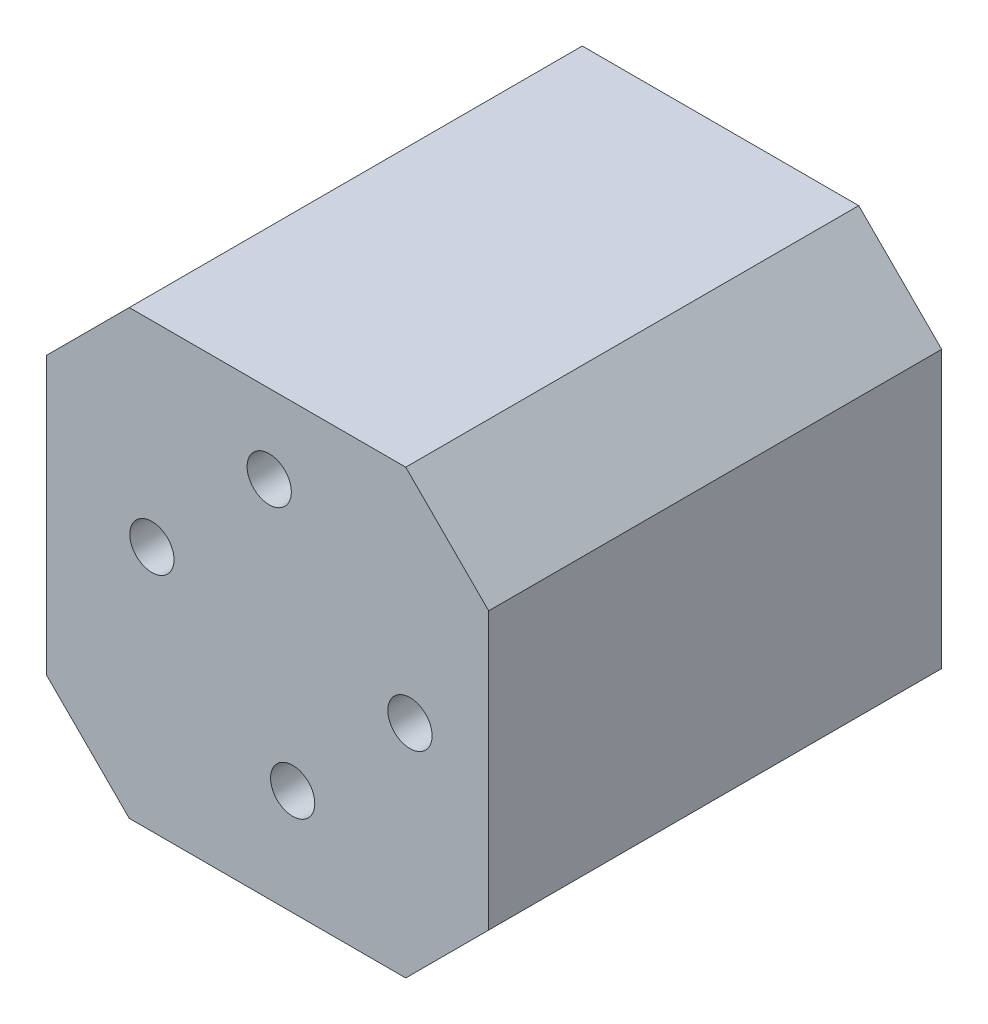
ISO-10303-21;
HEADER;
FILE_DESCRIPTION(('STEP AP214'),'2;1');
FILE_NAME('part.step','',(''),(''),'','','');
FILE_SCHEMA(('AUTOMOTIVE_DESIGN { 1 0 10303 214 1 1 1 1 }'));
ENDSEC;
DATA;
#1=APPLICATION_CONTEXT('core data for automotive mechanical design processes');
#2=APPLICATION_PROTOCOL_DEFINITION('international standard','automotive_design',2000,#1);
#3=PRODUCT_CONTEXT('',#1,'mechanical');
#4=PRODUCT('Part','Part','',(#3));
#5=PRODUCT_RELATED_PRODUCT_CATEGORY('part','',(#4));
#6=PRODUCT_DEFINITION_FORMATION('','',#4);
#7=PRODUCT_DEFINITION_CONTEXT('part definition',#1,'design');
#8=PRODUCT_DEFINITION('design','',#6,#7);
#9=PRODUCT_DEFINITION_SHAPE('','',#8);
#10=(LENGTH_UNIT() NAMED_UNIT(*) SI_UNIT(.MILLI.,.METRE.));
#11=(NAMED_UNIT(*) PLANE_ANGLE_UNIT() SI_UNIT($,.RADIAN.));
#12=(NAMED_UNIT(*) SI_UNIT($,.STERADIAN.) SOLID_ANGLE_UNIT());
#13=UNCERTAINTY_MEASURE_WITH_UNIT(LENGTH_MEASURE(1.E-05),#10,'distance_accuracy_value','');
#14=(GEOMETRIC_REPRESENTATION_CONTEXT(3) GLOBAL_UNCERTAINTY_ASSIGNED_CONTEXT((#13)) GLOBAL_UNIT_ASSIGNED_CONTEXT((#10,
#11,#12)) REPRESENTATION_CONTEXT('',''));
#15=CARTESIAN_POINT('',(0.,0.,0.));
#16=DIRECTION('',(0.,0.,1.));
#17=DIRECTION('',(1.,0.,0.));
#18=AXIS2_PLACEMENT_3D('',#15,#16,#17);
#19=CARTESIAN_POINT('',(7.5,40.,40.96));
#20=DIRECTION('',(0.,-1.,0.));
#21=DIRECTION('',(0.,0.,-1.));
#22=AXIS2_PLACEMENT_3D('',#19,#20,#21);
#23=PLANE('',#22);
#24=DIRECTION('',(-1.,0.,0.));
#25=VECTOR('',#24,1.);
#26=CARTESIAN_POINT('',(7.5,40.,0.));
#27=LINE('',#26,#25);
#28=CARTESIAN_POINT('',(32.5,40.,0.));
#29=VERTEX_POINT('',#28);
#30=CARTESIAN_POINT('',(7.5,40.,0.));
#31=VERTEX_POINT('',#30);
#32=EDGE_CURVE('E139',#29,#31,#27,.T.);
#33=ORIENTED_EDGE('',*,*,#32,.T.);
#34=DIRECTION('',(0.,0.,-1.));
#35=VECTOR('',#34,1.);
#36=CARTESIAN_POINT('',(7.5,40.,40.96));
#37=LINE('',#36,#35);
#38=CARTESIAN_POINT('',(7.5,40.,40.96));
#39=VERTEX_POINT('',#38);
#40=EDGE_CURVE('E11',#39,#31,#37,.T.);
#41=ORIENTED_EDGE('',*,*,#40,.F.);
#42=DIRECTION('',(-1.,0.,0.));
#43=VECTOR('',#42,1.);
#44=CARTESIAN_POINT('',(7.5,40.,40.96));
#45=LINE('',#44,#43);
#46=CARTESIAN_POINT('',(32.5,40.,40.96));
#47=VERTEX_POINT('',#46);
#48=EDGE_CURVE('E162',#47,#39,#45,.T.);
#49=ORIENTED_EDGE('',*,*,#48,.F.);
#50=DIRECTION('',(0.,0.,-1.));
#51=VECTOR('',#50,1.);
#52=CARTESIAN_POINT('',(32.5,40.,40.96));
#53=LINE('',#52,#51);
#54=EDGE_CURVE('E135',#47,#29,#53,.T.);
#55=ORIENTED_EDGE('',*,*,#54,.T.);
#56=EDGE_LOOP('',(#33,#41,#49,#55));
#57=FACE_BOUND('',#56,.T.);
#58=ADVANCED_FACE('F38',(#57),#23,.F.);
#59=CARTESIAN_POINT('',(7.5,40.,40.96));
#60=DIRECTION('',(0.707106781186548,-0.707106781186547,0.));
#61=DIRECTION('',(0.707106781186547,0.707106781186548,0.));
#62=AXIS2_PLACEMENT_3D('',#59,#60,#61);
#63=PLANE('',#62);
#64=DIRECTION('',(-0.707106781186547,-0.707106781186548,0.));
#65=VECTOR('',#64,1.);
#66=CARTESIAN_POINT('',(7.5,40.,0.));
#67=LINE('',#66,#65);
#68=CARTESIAN_POINT('',(0.,32.5,0.));
#69=VERTEX_POINT('',#68);
#70=EDGE_CURVE('E143',#31,#69,#67,.T.);
#71=ORIENTED_EDGE('',*,*,#70,.T.);
#72=DIRECTION('',(0.,0.,-1.));
#73=VECTOR('',#72,1.);
#74=CARTESIAN_POINT('',(0.,32.5,40.96));
#75=LINE('',#74,#73);
#76=CARTESIAN_POINT('',(0.,32.5,40.96));
#77=VERTEX_POINT('',#76);
#78=EDGE_CURVE('E47',#77,#69,#75,.T.);
#79=ORIENTED_EDGE('',*,*,#78,.F.);
#80=DIRECTION('',(-0.707106781186547,-0.707106781186548,0.));
#81=VECTOR('',#80,1.);
#82=CARTESIAN_POINT('',(7.5,40.,40.96));
#83=LINE('',#82,#81);
#84=EDGE_CURVE('E98',#39,#77,#83,.T.);
#85=ORIENTED_EDGE('',*,*,#84,.F.);
#86=ORIENTED_EDGE('',*,*,#40,.T.);
#87=EDGE_LOOP('',(#71,#79,#85,#86));
#88=FACE_BOUND('',#87,.T.);
#89=ADVANCED_FACE('F272',(#88),#63,.F.);
#90=CARTESIAN_POINT('',(0.,7.5,40.96));
#91=DIRECTION('',(1.,0.,0.));
#92=DIRECTION('',(0.,0.,-1.));
#93=AXIS2_PLACEMENT_3D('',#90,#91,#92);
#94=PLANE('',#93);
#95=DIRECTION('',(0.,-1.,0.));
#96=VECTOR('',#95,1.);
#97=CARTESIAN_POINT('',(0.,7.5,0.));
#98=LINE('',#97,#96);
#99=CARTESIAN_POINT('',(0.,7.5,0.));
#100=VERTEX_POINT('',#99);
#101=EDGE_CURVE('E147',#69,#100,#98,.T.);
#102=ORIENTED_EDGE('',*,*,#101,.T.);
#103=DIRECTION('',(0.,0.,-1.));
#104=VECTOR('',#103,1.);
#105=CARTESIAN_POINT('',(0.,7.5,40.96));
#106=LINE('',#105,#104);
#107=CARTESIAN_POINT('',(0.,7.5,40.96));
#108=VERTEX_POINT('',#107);
#109=EDGE_CURVE('E173',#108,#100,#106,.T.);
#110=ORIENTED_EDGE('',*,*,#109,.F.);
#111=DIRECTION('',(0.,-1.,0.));
#112=VECTOR('',#111,1.);
#113=CARTESIAN_POINT('',(0.,7.5,40.96));
#114=LINE('',#113,#112);
#115=EDGE_CURVE('E183',#77,#108,#114,.T.);
#116=ORIENTED_EDGE('',*,*,#115,.F.);
#117=ORIENTED_EDGE('',*,*,#78,.T.);
#118=EDGE_LOOP('',(#102,#110,#116,#117));
#119=FACE_BOUND('',#118,.T.);
#120=ADVANCED_FACE('F181',(#119),#94,.F.);
#121=CARTESIAN_POINT('',(0.,7.5,40.96));
#122=DIRECTION('',(0.707106781186547,0.707106781186548,0.));
#123=DIRECTION('',(-0.707106781186548,0.707106781186547,0.));
#124=AXIS2_PLACEMENT_3D('',#121,#122,#123);
#125=PLANE('',#124);
#126=DIRECTION('',(0.707106781186548,-0.707106781186547,0.));
#127=VECTOR('',#126,1.);
#128=CARTESIAN_POINT('',(0.,7.5,0.));
#129=LINE('',#128,#127);
#130=CARTESIAN_POINT('',(7.5,0.,0.));
#131=VERTEX_POINT('',#130);
#132=EDGE_CURVE('E150',#100,#131,#129,.T.);
#133=ORIENTED_EDGE('',*,*,#132,.T.);
#134=DIRECTION('',(0.,0.,-1.));
#135=VECTOR('',#134,1.);
#136=CARTESIAN_POINT('',(7.5,0.,40.96));
#137=LINE('',#136,#135);
#138=CARTESIAN_POINT('',(7.5,0.,40.96));
#139=VERTEX_POINT('',#138);
#140=EDGE_CURVE('E169',#139,#131,#137,.T.);
#141=ORIENTED_EDGE('',*,*,#140,.F.);
#142=DIRECTION('',(0.707106781186548,-0.707106781186547,0.));
#143=VECTOR('',#142,1.);
#144=CARTESIAN_POINT('',(0.,7.5,40.96));
#145=LINE('',#144,#143);
#146=EDGE_CURVE('E196',#108,#139,#145,.T.);
#147=ORIENTED_EDGE('',*,*,#146,.F.);
#148=ORIENTED_EDGE('',*,*,#109,.T.);
#149=EDGE_LOOP('',(#133,#141,#147,#148));
#150=FACE_BOUND('',#149,.T.);
#151=ADVANCED_FACE('F191',(#150),#125,.F.);
#152=CARTESIAN_POINT('',(7.5,0.,40.96));
#153=DIRECTION('',(0.,1.,0.));
#154=DIRECTION('',(0.,0.,1.));
#155=AXIS2_PLACEMENT_3D('',#152,#153,#154);
#156=PLANE('',#155);
#157=DIRECTION('',(1.,0.,0.));
#158=VECTOR('',#157,1.);
#159=CARTESIAN_POINT('',(7.5,0.,0.));
#160=LINE('',#159,#158);
#161=CARTESIAN_POINT('',(32.5,0.,0.));
#162=VERTEX_POINT('',#161);
#163=EDGE_CURVE('E153',#131,#162,#160,.T.);
#164=ORIENTED_EDGE('',*,*,#163,.T.);
#165=DIRECTION('',(0.,0.,-1.));
#166=VECTOR('',#165,1.);
#167=CARTESIAN_POINT('',(32.5,0.,40.96));
#168=LINE('',#167,#166);
#169=CARTESIAN_POINT('',(32.5,0.,40.96));
#170=VERTEX_POINT('',#169);
#171=EDGE_CURVE('E128',#170,#162,#168,.T.);
#172=ORIENTED_EDGE('',*,*,#171,.F.);
#173=DIRECTION('',(1.,0.,0.));
#174=VECTOR('',#173,1.);
#175=CARTESIAN_POINT('',(7.5,0.,40.96));
#176=LINE('',#175,#174);
#177=EDGE_CURVE('E117',#139,#170,#176,.T.);
#178=ORIENTED_EDGE('',*,*,#177,.F.);
#179=ORIENTED_EDGE('',*,*,#140,.T.);
#180=EDGE_LOOP('',(#164,#172,#178,#179));
#181=FACE_BOUND('',#180,.T.);
#182=ADVANCED_FACE('F194',(#181),#156,.F.);
#183=CARTESIAN_POINT('',(40.,7.5,40.96));
#184=DIRECTION('',(-0.707106781186548,0.707106781186547,0.));
#185=DIRECTION('',(-0.707106781186547,-0.707106781186548,0.));
#186=AXIS2_PLACEMENT_3D('',#183,#184,#185);
#187=PLANE('',#186);
#188=DIRECTION('',(0.707106781186547,0.707106781186548,0.));
#189=VECTOR('',#188,1.);
#190=CARTESIAN_POINT('',(40.,7.5,0.));
#191=LINE('',#190,#189);
#192=CARTESIAN_POINT('',(40.,7.5,0.));
#193=VERTEX_POINT('',#192);
#194=EDGE_CURVE('E126',#162,#193,#191,.T.);
#195=ORIENTED_EDGE('',*,*,#194,.T.);
#196=DIRECTION('',(0.,0.,-1.));
#197=VECTOR('',#196,1.);
#198=CARTESIAN_POINT('',(40.,7.5,40.96));
#199=LINE('',#198,#197);
#200=CARTESIAN_POINT('',(40.,7.5,40.96));
#201=VERTEX_POINT('',#200);
#202=EDGE_CURVE('E123',#201,#193,#199,.T.);
#203=ORIENTED_EDGE('',*,*,#202,.F.);
#204=DIRECTION('',(0.707106781186547,0.707106781186548,0.));
#205=VECTOR('',#204,1.);
#206=CARTESIAN_POINT('',(40.,7.5,40.96));
#207=LINE('',#206,#205);
#208=EDGE_CURVE('E111',#170,#201,#207,.T.);
#209=ORIENTED_EDGE('',*,*,#208,.F.);
#210=ORIENTED_EDGE('',*,*,#171,.T.);
#211=EDGE_LOOP('',(#195,#203,#209,#210));
#212=FACE_BOUND('',#211,.T.);
#213=ADVANCED_FACE('F124',(#212),#187,.F.);
#214=CARTESIAN_POINT('',(40.,7.5,40.96));
#215=DIRECTION('',(-1.,0.,0.));
#216=DIRECTION('',(0.,0.,1.));
#217=AXIS2_PLACEMENT_3D('',#214,#215,#216);
#218=PLANE('',#217);
#219=DIRECTION('',(0.,1.,0.));
#220=VECTOR('',#219,1.);
#221=CARTESIAN_POINT('',(40.,7.5,0.));
#222=LINE('',#221,#220);
#223=CARTESIAN_POINT('',(40.,32.5,0.));
#224=VERTEX_POINT('',#223);
#225=EDGE_CURVE('E84',#193,#224,#222,.T.);
#226=ORIENTED_EDGE('',*,*,#225,.T.);
#227=DIRECTION('',(0.,0.,-1.));
#228=VECTOR('',#227,1.);
#229=CARTESIAN_POINT('',(40.,32.5,40.96));
#230=LINE('',#229,#228);
#231=CARTESIAN_POINT('',(40.,32.5,40.96));
#232=VERTEX_POINT('',#231);
#233=EDGE_CURVE('E129',#232,#224,#230,.T.);
#234=ORIENTED_EDGE('',*,*,#233,.F.);
#235=DIRECTION('',(0.,1.,0.));
#236=VECTOR('',#235,1.);
#237=CARTESIAN_POINT('',(40.,7.5,40.96));
#238=LINE('',#237,#236);
#239=EDGE_CURVE('E115',#201,#232,#238,.T.);
#240=ORIENTED_EDGE('',*,*,#239,.F.);
#241=ORIENTED_EDGE('',*,*,#202,.T.);
#242=EDGE_LOOP('',(#226,#234,#240,#241));
#243=FACE_BOUND('',#242,.T.);
#244=ADVANCED_FACE('F131',(#243),#218,.F.);
#245=CARTESIAN_POINT('',(32.5,40.,40.96));
#246=DIRECTION('',(-0.707106781186548,-0.707106781186548,0.));
#247=DIRECTION('',(0.707106781186548,-0.707106781186548,0.));
#248=AXIS2_PLACEMENT_3D('',#245,#246,#247);
#249=PLANE('',#248);
#250=DIRECTION('',(-0.707106781186548,0.707106781186548,0.));
#251=VECTOR('',#250,1.);
#252=CARTESIAN_POINT('',(32.5,40.,0.));
#253=LINE('',#252,#251);
#254=EDGE_CURVE('E90',#224,#29,#253,.T.);
#255=ORIENTED_EDGE('',*,*,#254,.T.);
#256=ORIENTED_EDGE('',*,*,#54,.F.);
#257=DIRECTION('',(-0.707106781186548,0.707106781186548,0.));
#258=VECTOR('',#257,1.);
#259=CARTESIAN_POINT('',(32.5,40.,40.96));
#260=LINE('',#259,#258);
#261=EDGE_CURVE('E55',#232,#47,#260,.T.);
#262=ORIENTED_EDGE('',*,*,#261,.F.);
#263=ORIENTED_EDGE('',*,*,#233,.T.);
#264=EDGE_LOOP('',(#255,#256,#262,#263));
#265=FACE_BOUND('',#264,.T.);
#266=ADVANCED_FACE('F249',(#265),#249,.F.);
#267=CARTESIAN_POINT('',(0.,0.,40.96));
#268=DIRECTION('',(0.,0.,1.));
#269=DIRECTION('',(1.,0.,0.));
#270=AXIS2_PLACEMENT_3D('',#267,#268,#269);
#271=PLANE('',#270);
#272=CARTESIAN_POINT('',(20.1543708055382,32.88225099,40.96));
#273=DIRECTION('',(0.,0.,1.));
#274=DIRECTION('',(1.,0.,0.));
#275=AXIS2_PLACEMENT_3D('',#272,#273,#274);
#276=CIRCLE('',#275,2.);
#277=CARTESIAN_POINT('',(22.1543708055382,32.88225099,40.96));
#278=VERTEX_POINT('',#277);
#279=EDGE_CURVE('E230',#278,#278,#276,.T.);
#280=ORIENTED_EDGE('',*,*,#279,.F.);
#281=EDGE_LOOP('',(#280));
#282=FACE_BOUND('',#281,.T.);
#283=CARTESIAN_POINT('',(9.54776908774003,22.2756492722018,40.96));
#284=DIRECTION('',(0.,0.,1.));
#285=DIRECTION('',(1.,0.,0.));
#286=AXIS2_PLACEMENT_3D('',#283,#284,#285);
#287=CIRCLE('',#286,2.);
#288=CARTESIAN_POINT('',(11.54776908774,22.2756492722018,40.96));
#289=VERTEX_POINT('',#288);
#290=EDGE_CURVE('E222',#289,#289,#287,.T.);
#291=ORIENTED_EDGE('',*,*,#290,.F.);
#292=EDGE_LOOP('',(#291));
#293=FACE_BOUND('',#292,.T.);
#294=CARTESIAN_POINT('',(22.2756911490979,9.54772721084395,40.96));
#295=DIRECTION('',(0.,0.,1.));
#296=DIRECTION('',(1.,0.,0.));
#297=AXIS2_PLACEMENT_3D('',#294,#295,#296);
#298=CIRCLE('',#297,2.00000000000001);
#299=CARTESIAN_POINT('',(24.2756911490979,9.54772721084395,40.96));
#300=VERTEX_POINT('',#299);
#301=EDGE_CURVE('E214',#300,#300,#298,.T.);
#302=ORIENTED_EDGE('',*,*,#301,.F.);
#303=EDGE_LOOP('',(#302));
#304=FACE_BOUND('',#303,.T.);
#305=CARTESIAN_POINT('',(32.8822928668961,20.1543289286422,40.96));
#306=DIRECTION('',(0.,0.,1.));
#307=DIRECTION('',(1.,0.,0.));
#308=AXIS2_PLACEMENT_3D('',#305,#306,#307);
#309=CIRCLE('',#308,2.);
#310=CARTESIAN_POINT('',(34.8822928668961,20.1543289286422,40.96));
#311=VERTEX_POINT('',#310);
#312=EDGE_CURVE('E206',#311,#311,#309,.T.);
#313=ORIENTED_EDGE('',*,*,#312,.F.);
#314=EDGE_LOOP('',(#313));
#315=FACE_BOUND('',#314,.T.);
#316=ORIENTED_EDGE('',*,*,#48,.T.);
#317=ORIENTED_EDGE('',*,*,#84,.T.);
#318=ORIENTED_EDGE('',*,*,#115,.T.);
#319=ORIENTED_EDGE('',*,*,#146,.T.);
#320=ORIENTED_EDGE('',*,*,#177,.T.);
#321=ORIENTED_EDGE('',*,*,#208,.T.);
#322=ORIENTED_EDGE('',*,*,#239,.T.);
#323=ORIENTED_EDGE('',*,*,#261,.T.);
#324=EDGE_LOOP('',(#316,#317,#318,#319,#320,#321,#322,#323));
#325=FACE_BOUND('',#324,.T.);
#326=ADVANCED_FACE('F113',(#282,#293,#304,#315,#325),#271,.T.);
#327=CARTESIAN_POINT('',(0.,0.,0.));
#328=DIRECTION('',(0.,0.,1.));
#329=DIRECTION('',(1.,0.,0.));
#330=AXIS2_PLACEMENT_3D('',#327,#328,#329);
#331=PLANE('',#330);
#332=CARTESIAN_POINT('',(20.1543708055382,32.88225099,0.));
#333=DIRECTION('',(0.,0.,1.));
#334=DIRECTION('',(1.,0.,0.));
#335=AXIS2_PLACEMENT_3D('',#332,#333,#334);
#336=CIRCLE('',#335,2.);
#337=CARTESIAN_POINT('',(22.1543708055382,32.88225099,0.));
#338=VERTEX_POINT('',#337);
#339=EDGE_CURVE('E144',#338,#338,#336,.T.);
#340=ORIENTED_EDGE('',*,*,#339,.T.);
#341=EDGE_LOOP('',(#340));
#342=FACE_BOUND('',#341,.T.);
#343=CARTESIAN_POINT('',(9.54776908774003,22.2756492722018,0.));
#344=DIRECTION('',(0.,0.,1.));
#345=DIRECTION('',(1.,0.,0.));
#346=AXIS2_PLACEMENT_3D('',#343,#344,#345);
#347=CIRCLE('',#346,2.);
#348=CARTESIAN_POINT('',(11.54776908774,22.2756492722018,0.));
#349=VERTEX_POINT('',#348);
#350=EDGE_CURVE('E226',#349,#349,#347,.T.);
#351=ORIENTED_EDGE('',*,*,#350,.T.);
#352=EDGE_LOOP('',(#351));
#353=FACE_BOUND('',#352,.T.);
#354=CARTESIAN_POINT('',(22.2756911490979,9.54772721084395,0.));
#355=DIRECTION('',(0.,0.,1.));
#356=DIRECTION('',(1.,0.,0.));
#357=AXIS2_PLACEMENT_3D('',#354,#355,#356);
#358=CIRCLE('',#357,2.00000000000001);
#359=CARTESIAN_POINT('',(24.2756911490979,9.54772721084395,0.));
#360=VERTEX_POINT('',#359);
#361=EDGE_CURVE('E218',#360,#360,#358,.T.);
#362=ORIENTED_EDGE('',*,*,#361,.T.);
#363=EDGE_LOOP('',(#362));
#364=FACE_BOUND('',#363,.T.);
#365=CARTESIAN_POINT('',(32.8822928668961,20.1543289286422,0.));
#366=DIRECTION('',(0.,0.,1.));
#367=DIRECTION('',(1.,0.,0.));
#368=AXIS2_PLACEMENT_3D('',#365,#366,#367);
#369=CIRCLE('',#368,2.);
#370=CARTESIAN_POINT('',(34.8822928668961,20.1543289286422,0.));
#371=VERTEX_POINT('',#370);
#372=EDGE_CURVE('E210',#371,#371,#369,.T.);
#373=ORIENTED_EDGE('',*,*,#372,.T.);
#374=EDGE_LOOP('',(#373));
#375=FACE_BOUND('',#374,.T.);
#376=ORIENTED_EDGE('',*,*,#32,.F.);
#377=ORIENTED_EDGE('',*,*,#254,.F.);
#378=ORIENTED_EDGE('',*,*,#225,.F.);
#379=ORIENTED_EDGE('',*,*,#194,.F.);
#380=ORIENTED_EDGE('',*,*,#163,.F.);
#381=ORIENTED_EDGE('',*,*,#132,.F.);
#382=ORIENTED_EDGE('',*,*,#101,.F.);
#383=ORIENTED_EDGE('',*,*,#70,.F.);
#384=EDGE_LOOP('',(#376,#377,#378,#379,#380,#381,#382,#383));
#385=FACE_BOUND('',#384,.T.);
#386=ADVANCED_FACE('F187',(#342,#353,#364,#375,#385),#331,.F.);
#387=CARTESIAN_POINT('',(32.8822928668961,20.1543289286422,0.));
#388=DIRECTION('',(0.,0.,1.));
#389=DIRECTION('',(1.,0.,0.));
#390=AXIS2_PLACEMENT_3D('',#387,#388,#389);
#391=CYLINDRICAL_SURFACE('',#390,2.);
#392=CARTESIAN_POINT('',(34.8822928668961,20.1543289286422,0.));
#393=CARTESIAN_POINT('',(34.8822928668961,20.1543289286422,0.426666666666666));
#394=CARTESIAN_POINT('',(34.8822928668961,20.1543289286422,0.853333333333333));
#395=CARTESIAN_POINT('',(34.8822928668961,20.1543289286422,1.70666666666667));
#396=CARTESIAN_POINT('',(34.8822928668961,20.1543289286422,2.13333333333333));
#397=CARTESIAN_POINT('',(34.8822928668961,20.1543289286422,2.98666666666667));
#398=CARTESIAN_POINT('',(34.8822928668961,20.1543289286422,3.41333333333333));
#399=CARTESIAN_POINT('',(34.8822928668961,20.1543289286422,4.26666666666667));
#400=CARTESIAN_POINT('',(34.8822928668961,20.1543289286422,4.69333333333333));
#401=CARTESIAN_POINT('',(34.8822928668961,20.1543289286422,5.54666666666667));
#402=CARTESIAN_POINT('',(34.8822928668961,20.1543289286422,5.97333333333333));
#403=CARTESIAN_POINT('',(34.8822928668961,20.1543289286422,6.82666666666667));
#404=CARTESIAN_POINT('',(34.8822928668961,20.1543289286422,7.25333333333333));
#405=CARTESIAN_POINT('',(34.8822928668961,20.1543289286422,8.10666666666667));
#406=CARTESIAN_POINT('',(34.8822928668961,20.1543289286422,8.53333333333333));
#407=CARTESIAN_POINT('',(34.8822928668961,20.1543289286422,9.38666666666667));
#408=CARTESIAN_POINT('',(34.8822928668961,20.1543289286422,9.81333333333333));
#409=CARTESIAN_POINT('',(34.8822928668961,20.1543289286422,10.6666666666667));
#410=CARTESIAN_POINT('',(34.8822928668961,20.1543289286422,11.0933333333333));
#411=CARTESIAN_POINT('',(34.8822928668961,20.1543289286422,11.9466666666667));
#412=CARTESIAN_POINT('',(34.8822928668961,20.1543289286422,12.3733333333333));
#413=CARTESIAN_POINT('',(34.8822928668961,20.1543289286422,13.2266666666667));
#414=CARTESIAN_POINT('',(34.8822928668961,20.1543289286422,13.6533333333333));
#415=CARTESIAN_POINT('',(34.8822928668961,20.1543289286422,14.5066666666667));
#416=CARTESIAN_POINT('',(34.8822928668961,20.1543289286422,14.9333333333333));
#417=CARTESIAN_POINT('',(34.8822928668961,20.1543289286422,15.7866666666667));
#418=CARTESIAN_POINT('',(34.8822928668961,20.1543289286422,16.2133333333333));
#419=CARTESIAN_POINT('',(34.8822928668961,20.1543289286422,17.0666666666667));
#420=CARTESIAN_POINT('',(34.8822928668961,20.1543289286422,17.4933333333333));
#421=CARTESIAN_POINT('',(34.8822928668961,20.1543289286422,18.3466666666667));
#422=CARTESIAN_POINT('',(34.8822928668961,20.1543289286422,18.7733333333333));
#423=CARTESIAN_POINT('',(34.8822928668961,20.1543289286422,19.6266666666667));
#424=CARTESIAN_POINT('',(34.8822928668961,20.1543289286422,20.0533333333333));
#425=CARTESIAN_POINT('',(34.8822928668961,20.1543289286422,20.9066666666667));
#426=CARTESIAN_POINT('',(34.8822928668961,20.1543289286422,21.3333333333333));
#427=CARTESIAN_POINT('',(34.8822928668961,20.1543289286422,22.1866666666667));
#428=CARTESIAN_POINT('',(34.8822928668961,20.1543289286422,22.6133333333333));
#429=CARTESIAN_POINT('',(34.8822928668961,20.1543289286422,23.4666666666667));
#430=CARTESIAN_POINT('',(34.8822928668961,20.1543289286422,23.8933333333333));
#431=CARTESIAN_POINT('',(34.8822928668961,20.1543289286422,24.7466666666667));
#432=CARTESIAN_POINT('',(34.8822928668961,20.1543289286422,25.1733333333333));
#433=CARTESIAN_POINT('',(34.8822928668961,20.1543289286422,26.0266666666667));
#434=CARTESIAN_POINT('',(34.8822928668961,20.1543289286422,26.4533333333333));
#435=CARTESIAN_POINT('',(34.8822928668961,20.1543289286422,27.3066666666667));
#436=CARTESIAN_POINT('',(34.8822928668961,20.1543289286422,27.7333333333333));
#437=CARTESIAN_POINT('',(34.8822928668961,20.1543289286422,28.5866666666667));
#438=CARTESIAN_POINT('',(34.8822928668961,20.1543289286422,29.0133333333333));
#439=CARTESIAN_POINT('',(34.8822928668961,20.1543289286422,29.8666666666667));
#440=CARTESIAN_POINT('',(34.8822928668961,20.1543289286422,30.2933333333333));
#441=CARTESIAN_POINT('',(34.8822928668961,20.1543289286422,31.1466666666667));
#442=CARTESIAN_POINT('',(34.8822928668961,20.1543289286422,31.5733333333333));
#443=CARTESIAN_POINT('',(34.8822928668961,20.1543289286422,32.4266666666667));
#444=CARTESIAN_POINT('',(34.8822928668961,20.1543289286422,32.8533333333333));
#445=CARTESIAN_POINT('',(34.8822928668961,20.1543289286422,33.7066666666667));
#446=CARTESIAN_POINT('',(34.8822928668961,20.1543289286422,34.1333333333333));
#447=CARTESIAN_POINT('',(34.8822928668961,20.1543289286422,34.9866666666667));
#448=CARTESIAN_POINT('',(34.8822928668961,20.1543289286422,35.4133333333333));
#449=CARTESIAN_POINT('',(34.8822928668961,20.1543289286422,36.2666666666667));
#450=CARTESIAN_POINT('',(34.8822928668961,20.1543289286422,36.6933333333333));
#451=CARTESIAN_POINT('',(34.8822928668961,20.1543289286422,37.5466666666667));
#452=CARTESIAN_POINT('',(34.8822928668961,20.1543289286422,37.9733333333333));
#453=CARTESIAN_POINT('',(34.8822928668961,20.1543289286422,38.8266666666667));
#454=CARTESIAN_POINT('',(34.8822928668961,20.1543289286422,39.2533333333333));
#455=CARTESIAN_POINT('',(34.8822928668961,20.1543289286422,40.1066666666667));
#456=CARTESIAN_POINT('',(34.8822928668961,20.1543289286422,40.5333333333333));
#457=CARTESIAN_POINT('',(34.8822928668961,20.1543289286422,40.96));
#458=B_SPLINE_CURVE_WITH_KNOTS('',3,(#392,#393,#394,#395,#396,#397,#398,#399,#400,#401,#402,
#403,#404,#405,#406,#407,#408,#409,#410,#411,#412,#413,#414,#415,#416,#417,#418,#419,#420,#421,
#422,#423,#424,#425,#426,#427,#428,#429,#430,#431,#432,#433,#434,#435,#436,#437,#438,#439,#440,
#441,#442,#443,#444,#445,#446,#447,#448,#449,#450,#451,#452,#453,#454,#455,#456,#457),
.UNSPECIFIED.,.F.,.F.,(4,2,2,2,2,2,2,2,2,2,2,2,2,2,2,2,2,2,2,2,2,2,2,2,2,2,2,2,2,2,2,2,4),(0.,
1.28,2.56,3.84,5.12,6.4,7.68,8.96,10.24,11.52,12.8,14.08,15.36,16.64,17.92,19.2,20.48,21.76,
23.04,24.32,25.6,26.88,28.16,29.44,30.72,32.,33.28,34.56,35.84,37.12,38.4,39.68,40.96),.UNSPECIFIED.);
#459=EDGE_CURVE('BSEAM257',#371,#311,#458,.T.);
#460=ORIENTED_EDGE('',*,*,#372,.F.);
#461=ORIENTED_EDGE('',*,*,#312,.T.);
#462=ORIENTED_EDGE('',*,*,#459,.T.);
#463=ORIENTED_EDGE('',*,*,#459,.F.);
#464=EDGE_LOOP('',(#460,#462,#461,#463));
#465=FACE_BOUND('',#464,.T.);
#466=ADVANCED_FACE('F257',(#465),#391,.F.);
#467=CARTESIAN_POINT('',(22.2756911490979,9.54772721084395,0.));
#468=DIRECTION('',(0.,0.,1.));
#469=DIRECTION('',(1.,0.,0.));
#470=AXIS2_PLACEMENT_3D('',#467,#468,#469);
#471=CYLINDRICAL_SURFACE('',#470,2.00000000000001);
#472=CARTESIAN_POINT('',(24.2756911490979,9.54772721084395,0.));
#473=CARTESIAN_POINT('',(24.2756911490979,9.54772721084395,0.426666666666666));
#474=CARTESIAN_POINT('',(24.2756911490979,9.54772721084395,0.853333333333333));
#475=CARTESIAN_POINT('',(24.2756911490979,9.54772721084395,1.70666666666667));
#476=CARTESIAN_POINT('',(24.2756911490979,9.54772721084395,2.13333333333333));
#477=CARTESIAN_POINT('',(24.2756911490979,9.54772721084395,2.98666666666667));
#478=CARTESIAN_POINT('',(24.2756911490979,9.54772721084395,3.41333333333333));
#479=CARTESIAN_POINT('',(24.2756911490979,9.54772721084395,4.26666666666667));
#480=CARTESIAN_POINT('',(24.2756911490979,9.54772721084395,4.69333333333333));
#481=CARTESIAN_POINT('',(24.2756911490979,9.54772721084395,5.54666666666667));
#482=CARTESIAN_POINT('',(24.2756911490979,9.54772721084395,5.97333333333333));
#483=CARTESIAN_POINT('',(24.2756911490979,9.54772721084395,6.82666666666667));
#484=CARTESIAN_POINT('',(24.2756911490979,9.54772721084395,7.25333333333333));
#485=CARTESIAN_POINT('',(24.2756911490979,9.54772721084395,8.10666666666667));
#486=CARTESIAN_POINT('',(24.2756911490979,9.54772721084395,8.53333333333333));
#487=CARTESIAN_POINT('',(24.2756911490979,9.54772721084395,9.38666666666667));
#488=CARTESIAN_POINT('',(24.2756911490979,9.54772721084395,9.81333333333333));
#489=CARTESIAN_POINT('',(24.2756911490979,9.54772721084395,10.6666666666667));
#490=CARTESIAN_POINT('',(24.2756911490979,9.54772721084395,11.0933333333333));
#491=CARTESIAN_POINT('',(24.2756911490979,9.54772721084395,11.9466666666667));
#492=CARTESIAN_POINT('',(24.2756911490979,9.54772721084395,12.3733333333333));
#493=CARTESIAN_POINT('',(24.2756911490979,9.54772721084395,13.2266666666667));
#494=CARTESIAN_POINT('',(24.2756911490979,9.54772721084395,13.6533333333333));
#495=CARTESIAN_POINT('',(24.2756911490979,9.54772721084395,14.5066666666667));
#496=CARTESIAN_POINT('',(24.2756911490979,9.54772721084395,14.9333333333333));
#497=CARTESIAN_POINT('',(24.2756911490979,9.54772721084395,15.7866666666667));
#498=CARTESIAN_POINT('',(24.2756911490979,9.54772721084395,16.2133333333333));
#499=CARTESIAN_POINT('',(24.2756911490979,9.54772721084395,17.0666666666667));
#500=CARTESIAN_POINT('',(24.2756911490979,9.54772721084395,17.4933333333333));
#501=CARTESIAN_POINT('',(24.2756911490979,9.54772721084395,18.3466666666667));
#502=CARTESIAN_POINT('',(24.2756911490979,9.54772721084395,18.7733333333333));
#503=CARTESIAN_POINT('',(24.2756911490979,9.54772721084395,19.6266666666667));
#504=CARTESIAN_POINT('',(24.2756911490979,9.54772721084395,20.0533333333333));
#505=CARTESIAN_POINT('',(24.2756911490979,9.54772721084395,20.9066666666667));
#506=CARTESIAN_POINT('',(24.2756911490979,9.54772721084395,21.3333333333333));
#507=CARTESIAN_POINT('',(24.2756911490979,9.54772721084395,22.1866666666667));
#508=CARTESIAN_POINT('',(24.2756911490979,9.54772721084395,22.6133333333333));
#509=CARTESIAN_POINT('',(24.2756911490979,9.54772721084395,23.4666666666667));
#510=CARTESIAN_POINT('',(24.2756911490979,9.54772721084395,23.8933333333333));
#511=CARTESIAN_POINT('',(24.2756911490979,9.54772721084395,24.7466666666667));
#512=CARTESIAN_POINT('',(24.2756911490979,9.54772721084395,25.1733333333333));
#513=CARTESIAN_POINT('',(24.2756911490979,9.54772721084395,26.0266666666667));
#514=CARTESIAN_POINT('',(24.2756911490979,9.54772721084395,26.4533333333333));
#515=CARTESIAN_POINT('',(24.2756911490979,9.54772721084395,27.3066666666667));
#516=CARTESIAN_POINT('',(24.2756911490979,9.54772721084395,27.7333333333333));
#517=CARTESIAN_POINT('',(24.2756911490979,9.54772721084395,28.5866666666667));
#518=CARTESIAN_POINT('',(24.2756911490979,9.54772721084395,29.0133333333333));
#519=CARTESIAN_POINT('',(24.2756911490979,9.54772721084395,29.8666666666667));
#520=CARTESIAN_POINT('',(24.2756911490979,9.54772721084395,30.2933333333333));
#521=CARTESIAN_POINT('',(24.2756911490979,9.54772721084395,31.1466666666667));
#522=CARTESIAN_POINT('',(24.2756911490979,9.54772721084395,31.5733333333333));
#523=CARTESIAN_POINT('',(24.2756911490979,9.54772721084395,32.4266666666667));
#524=CARTESIAN_POINT('',(24.2756911490979,9.54772721084395,32.8533333333333));
#525=CARTESIAN_POINT('',(24.2756911490979,9.54772721084395,33.7066666666667));
#526=CARTESIAN_POINT('',(24.2756911490979,9.54772721084395,34.1333333333333));
#527=CARTESIAN_POINT('',(24.2756911490979,9.54772721084395,34.9866666666667));
#528=CARTESIAN_POINT('',(24.2756911490979,9.54772721084395,35.4133333333333));
#529=CARTESIAN_POINT('',(24.2756911490979,9.54772721084395,36.2666666666667));
#530=CARTESIAN_POINT('',(24.2756911490979,9.54772721084395,36.6933333333333));
#531=CARTESIAN_POINT('',(24.2756911490979,9.54772721084395,37.5466666666667));
#532=CARTESIAN_POINT('',(24.2756911490979,9.54772721084395,37.9733333333333));
#533=CARTESIAN_POINT('',(24.2756911490979,9.54772721084395,38.8266666666667));
#534=CARTESIAN_POINT('',(24.2756911490979,9.54772721084395,39.2533333333333));
#535=CARTESIAN_POINT('',(24.2756911490979,9.54772721084395,40.1066666666667));
#536=CARTESIAN_POINT('',(24.2756911490979,9.54772721084395,40.5333333333333));
#537=CARTESIAN_POINT('',(24.2756911490979,9.54772721084395,40.96));
#538=B_SPLINE_CURVE_WITH_KNOTS('',3,(#472,#473,#474,#475,#476,#477,#478,#479,#480,#481,#482,
#483,#484,#485,#486,#487,#488,#489,#490,#491,#492,#493,#494,#495,#496,#497,#498,#499,#500,#501,
#502,#503,#504,#505,#506,#507,#508,#509,#510,#511,#512,#513,#514,#515,#516,#517,#518,#519,#520,
#521,#522,#523,#524,#525,#526,#527,#528,#529,#530,#531,#532,#533,#534,#535,#536,#537),
.UNSPECIFIED.,.F.,.F.,(4,2,2,2,2,2,2,2,2,2,2,2,2,2,2,2,2,2,2,2,2,2,2,2,2,2,2,2,2,2,2,2,4),(0.,
1.28,2.56,3.84,5.12,6.4,7.68,8.96,10.24,11.52,12.8,14.08,15.36,16.64,17.92,19.2,20.48,21.76,
23.04,24.32,25.6,26.88,28.16,29.44,30.72,32.,33.28,34.56,35.84,37.12,38.4,39.68,40.96),.UNSPECIFIED.);
#539=EDGE_CURVE('BSEAM259',#360,#300,#538,.T.);
#540=ORIENTED_EDGE('',*,*,#361,.F.);
#541=ORIENTED_EDGE('',*,*,#301,.T.);
#542=ORIENTED_EDGE('',*,*,#539,.T.);
#543=ORIENTED_EDGE('',*,*,#539,.F.);
#544=EDGE_LOOP('',(#540,#542,#541,#543));
#545=FACE_BOUND('',#544,.T.);
#546=ADVANCED_FACE('F259',(#545),#471,.F.);
#547=CARTESIAN_POINT('',(9.54776908774003,22.2756492722018,0.));
#548=DIRECTION('',(0.,0.,1.));
#549=DIRECTION('',(1.,0.,0.));
#550=AXIS2_PLACEMENT_3D('',#547,#548,#549);
#551=CYLINDRICAL_SURFACE('',#550,2.);
#552=CARTESIAN_POINT('',(11.54776908774,22.2756492722018,0.));
#553=CARTESIAN_POINT('',(11.54776908774,22.2756492722018,0.426666666666666));
#554=CARTESIAN_POINT('',(11.54776908774,22.2756492722018,0.853333333333333));
#555=CARTESIAN_POINT('',(11.54776908774,22.2756492722018,1.70666666666667));
#556=CARTESIAN_POINT('',(11.54776908774,22.2756492722018,2.13333333333333));
#557=CARTESIAN_POINT('',(11.54776908774,22.2756492722018,2.98666666666667));
#558=CARTESIAN_POINT('',(11.54776908774,22.2756492722018,3.41333333333333));
#559=CARTESIAN_POINT('',(11.54776908774,22.2756492722018,4.26666666666667));
#560=CARTESIAN_POINT('',(11.54776908774,22.2756492722018,4.69333333333333));
#561=CARTESIAN_POINT('',(11.54776908774,22.2756492722018,5.54666666666667));
#562=CARTESIAN_POINT('',(11.54776908774,22.2756492722018,5.97333333333333));
#563=CARTESIAN_POINT('',(11.54776908774,22.2756492722018,6.82666666666667));
#564=CARTESIAN_POINT('',(11.54776908774,22.2756492722018,7.25333333333333));
#565=CARTESIAN_POINT('',(11.54776908774,22.2756492722018,8.10666666666667));
#566=CARTESIAN_POINT('',(11.54776908774,22.2756492722018,8.53333333333333));
#567=CARTESIAN_POINT('',(11.54776908774,22.2756492722018,9.38666666666667));
#568=CARTESIAN_POINT('',(11.54776908774,22.2756492722018,9.81333333333333));
#569=CARTESIAN_POINT('',(11.54776908774,22.2756492722018,10.6666666666667));
#570=CARTESIAN_POINT('',(11.54776908774,22.2756492722018,11.0933333333333));
#571=CARTESIAN_POINT('',(11.54776908774,22.2756492722018,11.9466666666667));
#572=CARTESIAN_POINT('',(11.54776908774,22.2756492722018,12.3733333333333));
#573=CARTESIAN_POINT('',(11.54776908774,22.2756492722018,13.2266666666667));
#574=CARTESIAN_POINT('',(11.54776908774,22.2756492722018,13.6533333333333));
#575=CARTESIAN_POINT('',(11.54776908774,22.2756492722018,14.5066666666667));
#576=CARTESIAN_POINT('',(11.54776908774,22.2756492722018,14.9333333333333));
#577=CARTESIAN_POINT('',(11.54776908774,22.2756492722018,15.7866666666667));
#578=CARTESIAN_POINT('',(11.54776908774,22.2756492722018,16.2133333333333));
#579=CARTESIAN_POINT('',(11.54776908774,22.2756492722018,17.0666666666667));
#580=CARTESIAN_POINT('',(11.54776908774,22.2756492722018,17.4933333333333));
#581=CARTESIAN_POINT('',(11.54776908774,22.2756492722018,18.3466666666667));
#582=CARTESIAN_POINT('',(11.54776908774,22.2756492722018,18.7733333333333));
#583=CARTESIAN_POINT('',(11.54776908774,22.2756492722018,19.6266666666667));
#584=CARTESIAN_POINT('',(11.54776908774,22.2756492722018,20.0533333333333));
#585=CARTESIAN_POINT('',(11.54776908774,22.2756492722018,20.9066666666667));
#586=CARTESIAN_POINT('',(11.54776908774,22.2756492722018,21.3333333333333));
#587=CARTESIAN_POINT('',(11.54776908774,22.2756492722018,22.1866666666667));
#588=CARTESIAN_POINT('',(11.54776908774,22.2756492722018,22.6133333333333));
#589=CARTESIAN_POINT('',(11.54776908774,22.2756492722018,23.4666666666667));
#590=CARTESIAN_POINT('',(11.54776908774,22.2756492722018,23.8933333333333));
#591=CARTESIAN_POINT('',(11.54776908774,22.2756492722018,24.7466666666667));
#592=CARTESIAN_POINT('',(11.54776908774,22.2756492722018,25.1733333333333));
#593=CARTESIAN_POINT('',(11.54776908774,22.2756492722018,26.0266666666667));
#594=CARTESIAN_POINT('',(11.54776908774,22.2756492722018,26.4533333333333));
#595=CARTESIAN_POINT('',(11.54776908774,22.2756492722018,27.3066666666667));
#596=CARTESIAN_POINT('',(11.54776908774,22.2756492722018,27.7333333333333));
#597=CARTESIAN_POINT('',(11.54776908774,22.2756492722018,28.5866666666667));
#598=CARTESIAN_POINT('',(11.54776908774,22.2756492722018,29.0133333333333));
#599=CARTESIAN_POINT('',(11.54776908774,22.2756492722018,29.8666666666667));
#600=CARTESIAN_POINT('',(11.54776908774,22.2756492722018,30.2933333333333));
#601=CARTESIAN_POINT('',(11.54776908774,22.2756492722018,31.1466666666667));
#602=CARTESIAN_POINT('',(11.54776908774,22.2756492722018,31.5733333333333));
#603=CARTESIAN_POINT('',(11.54776908774,22.2756492722018,32.4266666666667));
#604=CARTESIAN_POINT('',(11.54776908774,22.2756492722018,32.8533333333333));
#605=CARTESIAN_POINT('',(11.54776908774,22.2756492722018,33.7066666666667));
#606=CARTESIAN_POINT('',(11.54776908774,22.2756492722018,34.1333333333333));
#607=CARTESIAN_POINT('',(11.54776908774,22.2756492722018,34.9866666666667));
#608=CARTESIAN_POINT('',(11.54776908774,22.2756492722018,35.4133333333333));
#609=CARTESIAN_POINT('',(11.54776908774,22.2756492722018,36.2666666666667));
#610=CARTESIAN_POINT('',(11.54776908774,22.2756492722018,36.6933333333333));
#611=CARTESIAN_POINT('',(11.54776908774,22.2756492722018,37.5466666666667));
#612=CARTESIAN_POINT('',(11.54776908774,22.2756492722018,37.9733333333333));
#613=CARTESIAN_POINT('',(11.54776908774,22.2756492722018,38.8266666666667));
#614=CARTESIAN_POINT('',(11.54776908774,22.2756492722018,39.2533333333333));
#615=CARTESIAN_POINT('',(11.54776908774,22.2756492722018,40.1066666666667));
#616=CARTESIAN_POINT('',(11.54776908774,22.2756492722018,40.5333333333333));
#617=CARTESIAN_POINT('',(11.54776908774,22.2756492722018,40.96));
#618=B_SPLINE_CURVE_WITH_KNOTS('',3,(#552,#553,#554,#555,#556,#557,#558,#559,#560,#561,#562,
#563,#564,#565,#566,#567,#568,#569,#570,#571,#572,#573,#574,#575,#576,#577,#578,#579,#580,#581,
#582,#583,#584,#585,#586,#587,#588,#589,#590,#591,#592,#593,#594,#595,#596,#597,#598,#599,#600,
#601,#602,#603,#604,#605,#606,#607,#608,#609,#610,#611,#612,#613,#614,#615,#616,#617),
.UNSPECIFIED.,.F.,.F.,(4,2,2,2,2,2,2,2,2,2,2,2,2,2,2,2,2,2,2,2,2,2,2,2,2,2,2,2,2,2,2,2,4),(0.,
1.28,2.56,3.84,5.12,6.4,7.68,8.96,10.24,11.52,12.8,14.08,15.36,16.64,17.92,19.2,20.48,21.76,
23.04,24.32,25.6,26.88,28.16,29.44,30.72,32.,33.28,34.56,35.84,37.12,38.4,39.68,40.96),.UNSPECIFIED.);
#619=EDGE_CURVE('BSEAM243',#349,#289,#618,.T.);
#620=ORIENTED_EDGE('',*,*,#350,.F.);
#621=ORIENTED_EDGE('',*,*,#290,.T.);
#622=ORIENTED_EDGE('',*,*,#619,.T.);
#623=ORIENTED_EDGE('',*,*,#619,.F.);
#624=EDGE_LOOP('',(#620,#622,#621,#623));
#625=FACE_BOUND('',#624,.T.);
#626=ADVANCED_FACE('F243',(#625),#551,.F.);
#627=CARTESIAN_POINT('',(20.1543708055382,32.88225099,0.));
#628=DIRECTION('',(0.,0.,1.));
#629=DIRECTION('',(1.,0.,0.));
#630=AXIS2_PLACEMENT_3D('',#627,#628,#629);
#631=CYLINDRICAL_SURFACE('',#630,2.);
#632=CARTESIAN_POINT('',(22.1543708055382,32.88225099,0.));
#633=CARTESIAN_POINT('',(22.1543708055382,32.88225099,0.426666666666666));
#634=CARTESIAN_POINT('',(22.1543708055382,32.88225099,0.853333333333333));
#635=CARTESIAN_POINT('',(22.1543708055382,32.88225099,1.70666666666667));
#636=CARTESIAN_POINT('',(22.1543708055382,32.88225099,2.13333333333333));
#637=CARTESIAN_POINT('',(22.1543708055382,32.88225099,2.98666666666667));
#638=CARTESIAN_POINT('',(22.1543708055382,32.88225099,3.41333333333333));
#639=CARTESIAN_POINT('',(22.1543708055382,32.88225099,4.26666666666667));
#640=CARTESIAN_POINT('',(22.1543708055382,32.88225099,4.69333333333333));
#641=CARTESIAN_POINT('',(22.1543708055382,32.88225099,5.54666666666667));
#642=CARTESIAN_POINT('',(22.1543708055382,32.88225099,5.97333333333333));
#643=CARTESIAN_POINT('',(22.1543708055382,32.88225099,6.82666666666667));
#644=CARTESIAN_POINT('',(22.1543708055382,32.88225099,7.25333333333333));
#645=CARTESIAN_POINT('',(22.1543708055382,32.88225099,8.10666666666667));
#646=CARTESIAN_POINT('',(22.1543708055382,32.88225099,8.53333333333333));
#647=CARTESIAN_POINT('',(22.1543708055382,32.88225099,9.38666666666667));
#648=CARTESIAN_POINT('',(22.1543708055382,32.88225099,9.81333333333333));
#649=CARTESIAN_POINT('',(22.1543708055382,32.88225099,10.6666666666667));
#650=CARTESIAN_POINT('',(22.1543708055382,32.88225099,11.0933333333333));
#651=CARTESIAN_POINT('',(22.1543708055382,32.88225099,11.9466666666667));
#652=CARTESIAN_POINT('',(22.1543708055382,32.88225099,12.3733333333333));
#653=CARTESIAN_POINT('',(22.1543708055382,32.88225099,13.2266666666667));
#654=CARTESIAN_POINT('',(22.1543708055382,32.88225099,13.6533333333333));
#655=CARTESIAN_POINT('',(22.1543708055382,32.88225099,14.5066666666667));
#656=CARTESIAN_POINT('',(22.1543708055382,32.88225099,14.9333333333333));
#657=CARTESIAN_POINT('',(22.1543708055382,32.88225099,15.7866666666667));
#658=CARTESIAN_POINT('',(22.1543708055382,32.88225099,16.2133333333333));
#659=CARTESIAN_POINT('',(22.1543708055382,32.88225099,17.0666666666667));
#660=CARTESIAN_POINT('',(22.1543708055382,32.88225099,17.4933333333333));
#661=CARTESIAN_POINT('',(22.1543708055382,32.88225099,18.3466666666667));
#662=CARTESIAN_POINT('',(22.1543708055382,32.88225099,18.7733333333333));
#663=CARTESIAN_POINT('',(22.1543708055382,32.88225099,19.6266666666667));
#664=CARTESIAN_POINT('',(22.1543708055382,32.88225099,20.0533333333333));
#665=CARTESIAN_POINT('',(22.1543708055382,32.88225099,20.9066666666667));
#666=CARTESIAN_POINT('',(22.1543708055382,32.88225099,21.3333333333333));
#667=CARTESIAN_POINT('',(22.1543708055382,32.88225099,22.1866666666667));
#668=CARTESIAN_POINT('',(22.1543708055382,32.88225099,22.6133333333333));
#669=CARTESIAN_POINT('',(22.1543708055382,32.88225099,23.4666666666667));
#670=CARTESIAN_POINT('',(22.1543708055382,32.88225099,23.8933333333333));
#671=CARTESIAN_POINT('',(22.1543708055382,32.88225099,24.7466666666667));
#672=CARTESIAN_POINT('',(22.1543708055382,32.88225099,25.1733333333333));
#673=CARTESIAN_POINT('',(22.1543708055382,32.88225099,26.0266666666667));
#674=CARTESIAN_POINT('',(22.1543708055382,32.88225099,26.4533333333333));
#675=CARTESIAN_POINT('',(22.1543708055382,32.88225099,27.3066666666667));
#676=CARTESIAN_POINT('',(22.1543708055382,32.88225099,27.7333333333333));
#677=CARTESIAN_POINT('',(22.1543708055382,32.88225099,28.5866666666667));
#678=CARTESIAN_POINT('',(22.1543708055382,32.88225099,29.0133333333333));
#679=CARTESIAN_POINT('',(22.1543708055382,32.88225099,29.8666666666667));
#680=CARTESIAN_POINT('',(22.1543708055382,32.88225099,30.2933333333333));
#681=CARTESIAN_POINT('',(22.1543708055382,32.88225099,31.1466666666667));
#682=CARTESIAN_POINT('',(22.1543708055382,32.88225099,31.5733333333333));
#683=CARTESIAN_POINT('',(22.1543708055382,32.88225099,32.4266666666667));
#684=CARTESIAN_POINT('',(22.1543708055382,32.88225099,32.8533333333333));
#685=CARTESIAN_POINT('',(22.1543708055382,32.88225099,33.7066666666667));
#686=CARTESIAN_POINT('',(22.1543708055382,32.88225099,34.1333333333333));
#687=CARTESIAN_POINT('',(22.1543708055382,32.88225099,34.9866666666667));
#688=CARTESIAN_POINT('',(22.1543708055382,32.88225099,35.4133333333333));
#689=CARTESIAN_POINT('',(22.1543708055382,32.88225099,36.2666666666667));
#690=CARTESIAN_POINT('',(22.1543708055382,32.88225099,36.6933333333333));
#691=CARTESIAN_POINT('',(22.1543708055382,32.88225099,37.5466666666667));
#692=CARTESIAN_POINT('',(22.1543708055382,32.88225099,37.9733333333333));
#693=CARTESIAN_POINT('',(22.1543708055382,32.88225099,38.8266666666667));
#694=CARTESIAN_POINT('',(22.1543708055382,32.88225099,39.2533333333333));
#695=CARTESIAN_POINT('',(22.1543708055382,32.88225099,40.1066666666667));
#696=CARTESIAN_POINT('',(22.1543708055382,32.88225099,40.5333333333333));
#697=CARTESIAN_POINT('',(22.1543708055382,32.88225099,40.96));
#698=B_SPLINE_CURVE_WITH_KNOTS('',3,(#632,#633,#634,#635,#636,#637,#638,#639,#640,#641,#642,
#643,#644,#645,#646,#647,#648,#649,#650,#651,#652,#653,#654,#655,#656,#657,#658,#659,#660,#661,
#662,#663,#664,#665,#666,#667,#668,#669,#670,#671,#672,#673,#674,#675,#676,#677,#678,#679,#680,
#681,#682,#683,#684,#685,#686,#687,#688,#689,#690,#691,#692,#693,#694,#695,#696,#697),
.UNSPECIFIED.,.F.,.F.,(4,2,2,2,2,2,2,2,2,2,2,2,2,2,2,2,2,2,2,2,2,2,2,2,2,2,2,2,2,2,2,2,4),(0.,
1.28,2.56,3.84,5.12,6.4,7.68,8.96,10.24,11.52,12.8,14.08,15.36,16.64,17.92,19.2,20.48,21.76,
23.04,24.32,25.6,26.88,28.16,29.44,30.72,32.,33.28,34.56,35.84,37.12,38.4,39.68,40.96),.UNSPECIFIED.);
#699=EDGE_CURVE('BSEAM240',#338,#278,#698,.T.);
#700=ORIENTED_EDGE('',*,*,#339,.F.);
#701=ORIENTED_EDGE('',*,*,#279,.T.);
#702=ORIENTED_EDGE('',*,*,#699,.T.);
#703=ORIENTED_EDGE('',*,*,#699,.F.);
#704=EDGE_LOOP('',(#700,#702,#701,#703));
#705=FACE_BOUND('',#704,.T.);
#706=ADVANCED_FACE('F240',(#705),#631,.F.);
#707=CLOSED_SHELL('',(#58,#89,#120,#151,#182,#213,#244,#266,#326,#386,#466,#546,#626,#706));
#708=MANIFOLD_SOLID_BREP('B2',#707);
#709=ADVANCED_BREP_SHAPE_REPRESENTATION('',(#18,#708),#14);
#710=SHAPE_DEFINITION_REPRESENTATION(#9,#709);
ENDSEC;
END-ISO-10303-21;
